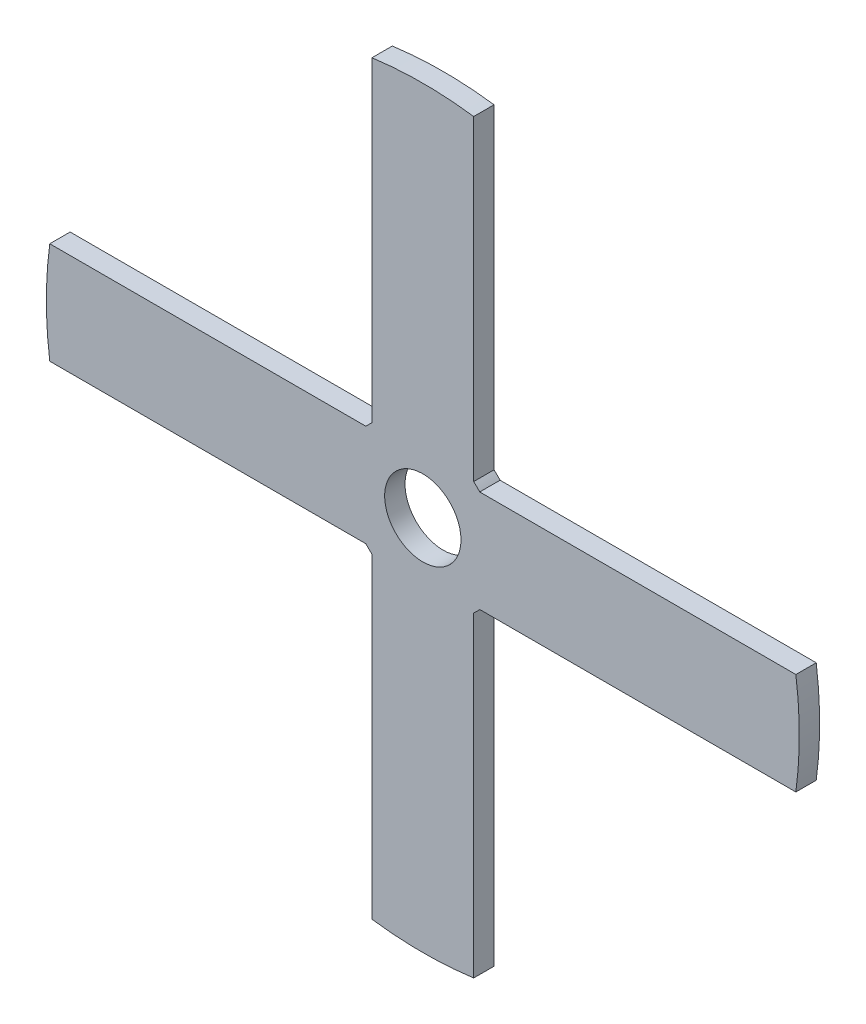
ISO-10303-21;
HEADER;
FILE_DESCRIPTION(('STEP AP214'),'2;1');
FILE_NAME('part.step','',(''),(''),'','','');
FILE_SCHEMA(('AUTOMOTIVE_DESIGN { 1 0 10303 214 1 1 1 1 }'));
ENDSEC;
DATA;
#1=APPLICATION_CONTEXT('core data for automotive mechanical design processes');
#2=APPLICATION_PROTOCOL_DEFINITION('international standard','automotive_design',2000,#1);
#3=PRODUCT_CONTEXT('',#1,'mechanical');
#4=PRODUCT('Part','Part','',(#3));
#5=PRODUCT_RELATED_PRODUCT_CATEGORY('part','',(#4));
#6=PRODUCT_DEFINITION_FORMATION('','',#4);
#7=PRODUCT_DEFINITION_CONTEXT('part definition',#1,'design');
#8=PRODUCT_DEFINITION('design','',#6,#7);
#9=PRODUCT_DEFINITION_SHAPE('','',#8);
#10=(LENGTH_UNIT() NAMED_UNIT(*) SI_UNIT(.MILLI.,.METRE.));
#11=(NAMED_UNIT(*) PLANE_ANGLE_UNIT() SI_UNIT($,.RADIAN.));
#12=(NAMED_UNIT(*) SI_UNIT($,.STERADIAN.) SOLID_ANGLE_UNIT());
#13=UNCERTAINTY_MEASURE_WITH_UNIT(LENGTH_MEASURE(1.E-05),#10,'distance_accuracy_value','');
#14=(GEOMETRIC_REPRESENTATION_CONTEXT(3) GLOBAL_UNCERTAINTY_ASSIGNED_CONTEXT((#13)) GLOBAL_UNIT_ASSIGNED_CONTEXT((#10,
#11,#12)) REPRESENTATION_CONTEXT('',''));
#15=CARTESIAN_POINT('',(0.,0.,0.));
#16=DIRECTION('',(0.,0.,1.));
#17=DIRECTION('',(1.,0.,0.));
#18=AXIS2_PLACEMENT_3D('',#15,#16,#17);
#19=CARTESIAN_POINT('',(0.,0.,8.));
#20=DIRECTION('',(0.,0.,1.));
#21=DIRECTION('',(1.,0.,0.));
#22=AXIS2_PLACEMENT_3D('',#19,#20,#21);
#23=PLANE('',#22);
#24=CARTESIAN_POINT('',(0.,0.,8.));
#25=DIRECTION('',(0.,0.,1.));
#26=DIRECTION('',(1.,0.,0.));
#27=AXIS2_PLACEMENT_3D('',#24,#25,#26);
#28=CIRCLE('',#27,148.);
#29=CARTESIAN_POINT('',(20.,146.642422238587,8.));
#30=VERTEX_POINT('',#29);
#31=CARTESIAN_POINT('',(-20.,146.642422238587,8.));
#32=VERTEX_POINT('',#31);
#33=EDGE_CURVE('E209',#30,#32,#28,.T.);
#34=ORIENTED_EDGE('',*,*,#33,.T.);
#35=DIRECTION('',(0.,-1.,0.));
#36=VECTOR('',#35,1.);
#37=CARTESIAN_POINT('',(-20.,22.3606797749979,8.));
#38=LINE('',#37,#36);
#39=CARTESIAN_POINT('',(-20.,22.3606797749979,8.));
#40=VERTEX_POINT('',#39);
#41=EDGE_CURVE('E117',#32,#40,#38,.T.);
#42=ORIENTED_EDGE('',*,*,#41,.T.);
#43=CARTESIAN_POINT('',(0.,0.,8.));
#44=DIRECTION('',(0.,0.,1.));
#45=DIRECTION('',(1.,0.,0.));
#46=AXIS2_PLACEMENT_3D('',#43,#44,#45);
#47=CIRCLE('',#46,30.);
#48=CARTESIAN_POINT('',(-22.3606797749977,20.0000000000002,8.));
#49=VERTEX_POINT('',#48);
#50=EDGE_CURVE('E248',#40,#49,#47,.T.);
#51=ORIENTED_EDGE('',*,*,#50,.T.);
#52=DIRECTION('',(-1.,0.,0.));
#53=VECTOR('',#52,1.);
#54=CARTESIAN_POINT('',(-22.3606797749977,20.0000000000002,8.));
#55=LINE('',#54,#53);
#56=CARTESIAN_POINT('',(-146.642422238587,20.,8.));
#57=VERTEX_POINT('',#56);
#58=EDGE_CURVE('E267',#49,#57,#55,.T.);
#59=ORIENTED_EDGE('',*,*,#58,.T.);
#60=CARTESIAN_POINT('',(0.,0.,8.));
#61=DIRECTION('',(0.,0.,1.));
#62=DIRECTION('',(1.,0.,0.));
#63=AXIS2_PLACEMENT_3D('',#60,#61,#62);
#64=CIRCLE('',#63,148.);
#65=CARTESIAN_POINT('',(-146.642422238587,-20.,8.));
#66=VERTEX_POINT('',#65);
#67=EDGE_CURVE('E264',#57,#66,#64,.T.);
#68=ORIENTED_EDGE('',*,*,#67,.T.);
#69=DIRECTION('',(1.,0.,0.));
#70=VECTOR('',#69,1.);
#71=CARTESIAN_POINT('',(-22.3606797749981,-19.9999999999998,8.));
#72=LINE('',#71,#70);
#73=CARTESIAN_POINT('',(-22.3606797749981,-19.9999999999998,8.));
#74=VERTEX_POINT('',#73);
#75=EDGE_CURVE('E266',#66,#74,#72,.T.);
#76=ORIENTED_EDGE('',*,*,#75,.T.);
#77=CARTESIAN_POINT('',(0.,0.,8.));
#78=DIRECTION('',(0.,0.,1.));
#79=DIRECTION('',(1.,0.,0.));
#80=AXIS2_PLACEMENT_3D('',#77,#78,#79);
#81=CIRCLE('',#80,30.);
#82=CARTESIAN_POINT('',(-20.0000000000001,-22.3606797749978,8.));
#83=VERTEX_POINT('',#82);
#84=EDGE_CURVE('E269',#74,#83,#81,.T.);
#85=ORIENTED_EDGE('',*,*,#84,.T.);
#86=DIRECTION('',(0.,-1.,0.));
#87=VECTOR('',#86,1.);
#88=CARTESIAN_POINT('',(-20.0000000000001,-22.3606797749978,8.));
#89=LINE('',#88,#87);
#90=CARTESIAN_POINT('',(-20.0000000000001,-146.642422238587,8.));
#91=VERTEX_POINT('',#90);
#92=EDGE_CURVE('E275',#83,#91,#89,.T.);
#93=ORIENTED_EDGE('',*,*,#92,.T.);
#94=CARTESIAN_POINT('',(0.,0.,8.));
#95=DIRECTION('',(0.,0.,1.));
#96=DIRECTION('',(1.,0.,0.));
#97=AXIS2_PLACEMENT_3D('',#94,#95,#96);
#98=CIRCLE('',#97,148.);
#99=CARTESIAN_POINT('',(20.,-146.642422238587,8.));
#100=VERTEX_POINT('',#99);
#101=EDGE_CURVE('E277',#91,#100,#98,.T.);
#102=ORIENTED_EDGE('',*,*,#101,.T.);
#103=DIRECTION('',(0.,1.,0.));
#104=VECTOR('',#103,1.);
#105=CARTESIAN_POINT('',(19.9999999999999,-22.360679774998,8.));
#106=LINE('',#105,#104);
#107=CARTESIAN_POINT('',(19.9999999999998,-22.360679774998,8.));
#108=VERTEX_POINT('',#107);
#109=EDGE_CURVE('E279',#100,#108,#106,.T.);
#110=ORIENTED_EDGE('',*,*,#109,.T.);
#111=CARTESIAN_POINT('',(0.,0.,8.));
#112=DIRECTION('',(0.,0.,1.));
#113=DIRECTION('',(1.,0.,0.));
#114=AXIS2_PLACEMENT_3D('',#111,#112,#113);
#115=CIRCLE('',#114,30.);
#116=CARTESIAN_POINT('',(22.3606797749978,-20.0000000000001,8.));
#117=VERTEX_POINT('',#116);
#118=EDGE_CURVE('E281',#108,#117,#115,.T.);
#119=ORIENTED_EDGE('',*,*,#118,.T.);
#120=DIRECTION('',(1.,0.,0.));
#121=VECTOR('',#120,1.);
#122=CARTESIAN_POINT('',(22.3606797749978,-20.0000000000001,8.));
#123=LINE('',#122,#121);
#124=CARTESIAN_POINT('',(146.642422238587,-20.,8.));
#125=VERTEX_POINT('',#124);
#126=EDGE_CURVE('E283',#117,#125,#123,.T.);
#127=ORIENTED_EDGE('',*,*,#126,.T.);
#128=CARTESIAN_POINT('',(0.,0.,8.));
#129=DIRECTION('',(0.,0.,1.));
#130=DIRECTION('',(1.,0.,0.));
#131=AXIS2_PLACEMENT_3D('',#128,#129,#130);
#132=CIRCLE('',#131,148.);
#133=CARTESIAN_POINT('',(146.642422238587,20.,8.));
#134=VERTEX_POINT('',#133);
#135=EDGE_CURVE('E160',#125,#134,#132,.T.);
#136=ORIENTED_EDGE('',*,*,#135,.T.);
#137=DIRECTION('',(-1.,0.,0.));
#138=VECTOR('',#137,1.);
#139=CARTESIAN_POINT('',(22.360679774998,19.9999999999999,8.));
#140=LINE('',#139,#138);
#141=CARTESIAN_POINT('',(22.360679774998,19.9999999999999,8.));
#142=VERTEX_POINT('',#141);
#143=EDGE_CURVE('E154',#134,#142,#140,.T.);
#144=ORIENTED_EDGE('',*,*,#143,.T.);
#145=CARTESIAN_POINT('',(0.,0.,8.));
#146=DIRECTION('',(0.,0.,1.));
#147=DIRECTION('',(1.,0.,0.));
#148=AXIS2_PLACEMENT_3D('',#145,#146,#147);
#149=CIRCLE('',#148,30.);
#150=CARTESIAN_POINT('',(20.,22.3606797749979,8.));
#151=VERTEX_POINT('',#150);
#152=EDGE_CURVE('E158',#142,#151,#149,.T.);
#153=ORIENTED_EDGE('',*,*,#152,.T.);
#154=DIRECTION('',(0.,1.,0.));
#155=VECTOR('',#154,1.);
#156=CARTESIAN_POINT('',(20.,22.3606797749979,8.));
#157=LINE('',#156,#155);
#158=EDGE_CURVE('E50',#151,#30,#157,.T.);
#159=ORIENTED_EDGE('',*,*,#158,.T.);
#160=EDGE_LOOP('',(#34,#42,#51,#59,#68,#76,#85,#93,#102,#110,#119,#127,#136,#144,#153,#159));
#161=FACE_BOUND('',#160,.T.);
#162=CARTESIAN_POINT('',(0.,0.,8.));
#163=DIRECTION('',(0.,0.,1.));
#164=DIRECTION('',(1.,0.,0.));
#165=AXIS2_PLACEMENT_3D('',#162,#163,#164);
#166=CIRCLE('',#165,15.);
#167=CARTESIAN_POINT('',(15.,0.,8.));
#168=VERTEX_POINT('',#167);
#169=EDGE_CURVE('E182',#168,#168,#166,.T.);
#170=ORIENTED_EDGE('',*,*,#169,.F.);
#171=EDGE_LOOP('',(#170));
#172=FACE_BOUND('',#171,.T.);
#173=ADVANCED_FACE('F33',(#161,#172),#23,.T.);
#174=CARTESIAN_POINT('',(0.,0.,0.));
#175=DIRECTION('',(0.,0.,1.));
#176=DIRECTION('',(1.,0.,0.));
#177=AXIS2_PLACEMENT_3D('',#174,#175,#176);
#178=PLANE('',#177);
#179=CARTESIAN_POINT('',(0.,0.,0.));
#180=DIRECTION('',(0.,0.,1.));
#181=DIRECTION('',(1.,0.,0.));
#182=AXIS2_PLACEMENT_3D('',#179,#180,#181);
#183=CIRCLE('',#182,148.);
#184=CARTESIAN_POINT('',(20.,146.642422238587,0.));
#185=VERTEX_POINT('',#184);
#186=CARTESIAN_POINT('',(-20.,146.642422238587,0.));
#187=VERTEX_POINT('',#186);
#188=EDGE_CURVE('E178',#185,#187,#183,.T.);
#189=ORIENTED_EDGE('',*,*,#188,.F.);
#190=DIRECTION('',(0.,1.,0.));
#191=VECTOR('',#190,1.);
#192=CARTESIAN_POINT('',(20.,22.3606797749979,0.));
#193=LINE('',#192,#191);
#194=CARTESIAN_POINT('',(20.,22.3606797749979,0.));
#195=VERTEX_POINT('',#194);
#196=EDGE_CURVE('E109',#195,#185,#193,.T.);
#197=ORIENTED_EDGE('',*,*,#196,.F.);
#198=CARTESIAN_POINT('',(0.,0.,0.));
#199=DIRECTION('',(0.,0.,1.));
#200=DIRECTION('',(1.,0.,0.));
#201=AXIS2_PLACEMENT_3D('',#198,#199,#200);
#202=CIRCLE('',#201,30.);
#203=CARTESIAN_POINT('',(22.360679774998,19.9999999999999,0.));
#204=VERTEX_POINT('',#203);
#205=EDGE_CURVE('E103',#204,#195,#202,.T.);
#206=ORIENTED_EDGE('',*,*,#205,.F.);
#207=DIRECTION('',(-1.,0.,0.));
#208=VECTOR('',#207,1.);
#209=CARTESIAN_POINT('',(22.360679774998,19.9999999999999,0.));
#210=LINE('',#209,#208);
#211=CARTESIAN_POINT('',(146.642422238587,20.,0.));
#212=VERTEX_POINT('',#211);
#213=EDGE_CURVE('E168',#212,#204,#210,.T.);
#214=ORIENTED_EDGE('',*,*,#213,.F.);
#215=CARTESIAN_POINT('',(0.,0.,0.));
#216=DIRECTION('',(0.,0.,1.));
#217=DIRECTION('',(1.,0.,0.));
#218=AXIS2_PLACEMENT_3D('',#215,#216,#217);
#219=CIRCLE('',#218,148.);
#220=CARTESIAN_POINT('',(146.642422238587,-20.,0.));
#221=VERTEX_POINT('',#220);
#222=EDGE_CURVE('E204',#221,#212,#219,.T.);
#223=ORIENTED_EDGE('',*,*,#222,.F.);
#224=DIRECTION('',(1.,0.,0.));
#225=VECTOR('',#224,1.);
#226=CARTESIAN_POINT('',(22.3606797749978,-20.0000000000001,0.));
#227=LINE('',#226,#225);
#228=CARTESIAN_POINT('',(22.3606797749978,-20.0000000000001,0.));
#229=VERTEX_POINT('',#228);
#230=EDGE_CURVE('E202',#229,#221,#227,.T.);
#231=ORIENTED_EDGE('',*,*,#230,.F.);
#232=CARTESIAN_POINT('',(0.,0.,0.));
#233=DIRECTION('',(0.,0.,1.));
#234=DIRECTION('',(1.,0.,0.));
#235=AXIS2_PLACEMENT_3D('',#232,#233,#234);
#236=CIRCLE('',#235,30.);
#237=CARTESIAN_POINT('',(19.9999999999998,-22.360679774998,0.));
#238=VERTEX_POINT('',#237);
#239=EDGE_CURVE('E200',#238,#229,#236,.T.);
#240=ORIENTED_EDGE('',*,*,#239,.F.);
#241=DIRECTION('',(0.,1.,0.));
#242=VECTOR('',#241,1.);
#243=CARTESIAN_POINT('',(19.9999999999999,-22.360679774998,0.));
#244=LINE('',#243,#242);
#245=CARTESIAN_POINT('',(20.,-146.642422238587,0.));
#246=VERTEX_POINT('',#245);
#247=EDGE_CURVE('E198',#246,#238,#244,.T.);
#248=ORIENTED_EDGE('',*,*,#247,.F.);
#249=CARTESIAN_POINT('',(0.,0.,0.));
#250=DIRECTION('',(0.,0.,1.));
#251=DIRECTION('',(1.,0.,0.));
#252=AXIS2_PLACEMENT_3D('',#249,#250,#251);
#253=CIRCLE('',#252,148.);
#254=CARTESIAN_POINT('',(-20.0000000000001,-146.642422238587,0.));
#255=VERTEX_POINT('',#254);
#256=EDGE_CURVE('E196',#255,#246,#253,.T.);
#257=ORIENTED_EDGE('',*,*,#256,.F.);
#258=DIRECTION('',(0.,-1.,0.));
#259=VECTOR('',#258,1.);
#260=CARTESIAN_POINT('',(-20.0000000000001,-22.3606797749978,0.));
#261=LINE('',#260,#259);
#262=CARTESIAN_POINT('',(-20.0000000000001,-22.3606797749978,0.));
#263=VERTEX_POINT('',#262);
#264=EDGE_CURVE('E194',#263,#255,#261,.T.);
#265=ORIENTED_EDGE('',*,*,#264,.F.);
#266=CARTESIAN_POINT('',(0.,0.,0.));
#267=DIRECTION('',(0.,0.,1.));
#268=DIRECTION('',(1.,0.,0.));
#269=AXIS2_PLACEMENT_3D('',#266,#267,#268);
#270=CIRCLE('',#269,30.);
#271=CARTESIAN_POINT('',(-22.3606797749981,-19.9999999999998,0.));
#272=VERTEX_POINT('',#271);
#273=EDGE_CURVE('E192',#272,#263,#270,.T.);
#274=ORIENTED_EDGE('',*,*,#273,.F.);
#275=DIRECTION('',(1.,0.,0.));
#276=VECTOR('',#275,1.);
#277=CARTESIAN_POINT('',(-22.3606797749981,-19.9999999999998,0.));
#278=LINE('',#277,#276);
#279=CARTESIAN_POINT('',(-146.642422238587,-20.,0.));
#280=VERTEX_POINT('',#279);
#281=EDGE_CURVE('E190',#280,#272,#278,.T.);
#282=ORIENTED_EDGE('',*,*,#281,.F.);
#283=CARTESIAN_POINT('',(0.,0.,0.));
#284=DIRECTION('',(0.,0.,1.));
#285=DIRECTION('',(1.,0.,0.));
#286=AXIS2_PLACEMENT_3D('',#283,#284,#285);
#287=CIRCLE('',#286,148.);
#288=CARTESIAN_POINT('',(-146.642422238587,20.,0.));
#289=VERTEX_POINT('',#288);
#290=EDGE_CURVE('E188',#289,#280,#287,.T.);
#291=ORIENTED_EDGE('',*,*,#290,.F.);
#292=DIRECTION('',(-1.,0.,0.));
#293=VECTOR('',#292,1.);
#294=CARTESIAN_POINT('',(-22.3606797749977,20.0000000000002,0.));
#295=LINE('',#294,#293);
#296=CARTESIAN_POINT('',(-22.3606797749977,20.0000000000002,0.));
#297=VERTEX_POINT('',#296);
#298=EDGE_CURVE('E186',#297,#289,#295,.T.);
#299=ORIENTED_EDGE('',*,*,#298,.F.);
#300=CARTESIAN_POINT('',(0.,0.,0.));
#301=DIRECTION('',(0.,0.,1.));
#302=DIRECTION('',(1.,0.,0.));
#303=AXIS2_PLACEMENT_3D('',#300,#301,#302);
#304=CIRCLE('',#303,30.);
#305=CARTESIAN_POINT('',(-20.,22.3606797749979,0.));
#306=VERTEX_POINT('',#305);
#307=EDGE_CURVE('E184',#306,#297,#304,.T.);
#308=ORIENTED_EDGE('',*,*,#307,.F.);
#309=DIRECTION('',(0.,-1.,0.));
#310=VECTOR('',#309,1.);
#311=CARTESIAN_POINT('',(-20.,22.3606797749979,0.));
#312=LINE('',#311,#310);
#313=EDGE_CURVE('E181',#187,#306,#312,.T.);
#314=ORIENTED_EDGE('',*,*,#313,.F.);
#315=EDGE_LOOP('',(#189,#197,#206,#214,#223,#231,#240,#248,#257,#265,#274,#282,#291,#299,#308,#314));
#316=FACE_BOUND('',#315,.T.);
#317=CARTESIAN_POINT('',(0.,0.,0.));
#318=DIRECTION('',(0.,0.,1.));
#319=DIRECTION('',(1.,0.,0.));
#320=AXIS2_PLACEMENT_3D('',#317,#318,#319);
#321=CIRCLE('',#320,15.);
#322=CARTESIAN_POINT('',(15.,0.,0.));
#323=VERTEX_POINT('',#322);
#324=EDGE_CURVE('E482',#323,#323,#321,.T.);
#325=ORIENTED_EDGE('',*,*,#324,.T.);
#326=EDGE_LOOP('',(#325));
#327=FACE_BOUND('',#326,.T.);
#328=ADVANCED_FACE('F252',(#316,#327),#178,.F.);
#329=CARTESIAN_POINT('',(0.,0.,8.));
#330=DIRECTION('',(0.,0.,-1.));
#331=DIRECTION('',(-1.,0.,0.));
#332=AXIS2_PLACEMENT_3D('',#329,#330,#331);
#333=CYLINDRICAL_SURFACE('',#332,148.);
#334=ORIENTED_EDGE('',*,*,#188,.T.);
#335=DIRECTION('',(0.,0.,-1.));
#336=VECTOR('',#335,1.);
#337=CARTESIAN_POINT('',(-20.,146.642422238587,8.));
#338=LINE('',#337,#336);
#339=EDGE_CURVE('E11',#32,#187,#338,.T.);
#340=ORIENTED_EDGE('',*,*,#339,.F.);
#341=ORIENTED_EDGE('',*,*,#33,.F.);
#342=DIRECTION('',(0.,0.,-1.));
#343=VECTOR('',#342,1.);
#344=CARTESIAN_POINT('',(20.,146.642422238587,8.));
#345=LINE('',#344,#343);
#346=EDGE_CURVE('E174',#30,#185,#345,.T.);
#347=ORIENTED_EDGE('',*,*,#346,.T.);
#348=EDGE_LOOP('',(#334,#340,#341,#347));
#349=FACE_BOUND('',#348,.T.);
#350=ADVANCED_FACE('F35',(#349),#333,.T.);
#351=CARTESIAN_POINT('',(-20.,22.3606797749979,8.));
#352=DIRECTION('',(1.,0.,0.));
#353=DIRECTION('',(0.,0.,-1.));
#354=AXIS2_PLACEMENT_3D('',#351,#352,#353);
#355=PLANE('',#354);
#356=ORIENTED_EDGE('',*,*,#313,.T.);
#357=DIRECTION('',(0.,0.,-1.));
#358=VECTOR('',#357,1.);
#359=CARTESIAN_POINT('',(-20.,22.3606797749979,8.));
#360=LINE('',#359,#358);
#361=EDGE_CURVE('E42',#40,#306,#360,.T.);
#362=ORIENTED_EDGE('',*,*,#361,.F.);
#363=ORIENTED_EDGE('',*,*,#41,.F.);
#364=ORIENTED_EDGE('',*,*,#339,.T.);
#365=EDGE_LOOP('',(#356,#362,#363,#364));
#366=FACE_BOUND('',#365,.T.);
#367=ADVANCED_FACE('F317',(#366),#355,.F.);
#368=CARTESIAN_POINT('',(0.,0.,8.));
#369=DIRECTION('',(0.,0.,-1.));
#370=DIRECTION('',(-1.,0.,0.));
#371=AXIS2_PLACEMENT_3D('',#368,#369,#370);
#372=CYLINDRICAL_SURFACE('',#371,30.);
#373=ORIENTED_EDGE('',*,*,#307,.T.);
#374=DIRECTION('',(0.,0.,-1.));
#375=VECTOR('',#374,1.);
#376=CARTESIAN_POINT('',(-22.3606797749977,20.0000000000002,8.));
#377=LINE('',#376,#375);
#378=EDGE_CURVE('E240',#49,#297,#377,.T.);
#379=ORIENTED_EDGE('',*,*,#378,.F.);
#380=ORIENTED_EDGE('',*,*,#50,.F.);
#381=ORIENTED_EDGE('',*,*,#361,.T.);
#382=EDGE_LOOP('',(#373,#379,#380,#381));
#383=FACE_BOUND('',#382,.T.);
#384=ADVANCED_FACE('F246',(#383),#372,.T.);
#385=CARTESIAN_POINT('',(-22.3606797749977,20.0000000000002,8.));
#386=DIRECTION('',(0.,-1.,0.));
#387=DIRECTION('',(1.,0.,0.));
#388=AXIS2_PLACEMENT_3D('',#385,#386,#387);
#389=PLANE('',#388);
#390=ORIENTED_EDGE('',*,*,#298,.T.);
#391=DIRECTION('',(0.,0.,-1.));
#392=VECTOR('',#391,1.);
#393=CARTESIAN_POINT('',(-146.642422238587,20.,8.));
#394=LINE('',#393,#392);
#395=EDGE_CURVE('E237',#57,#289,#394,.T.);
#396=ORIENTED_EDGE('',*,*,#395,.F.);
#397=ORIENTED_EDGE('',*,*,#58,.F.);
#398=ORIENTED_EDGE('',*,*,#378,.T.);
#399=EDGE_LOOP('',(#390,#396,#397,#398));
#400=FACE_BOUND('',#399,.T.);
#401=ADVANCED_FACE('F258',(#400),#389,.F.);
#402=CARTESIAN_POINT('',(0.,0.,8.));
#403=DIRECTION('',(0.,0.,-1.));
#404=DIRECTION('',(-1.,0.,0.));
#405=AXIS2_PLACEMENT_3D('',#402,#403,#404);
#406=CYLINDRICAL_SURFACE('',#405,148.);
#407=ORIENTED_EDGE('',*,*,#290,.T.);
#408=DIRECTION('',(0.,0.,-1.));
#409=VECTOR('',#408,1.);
#410=CARTESIAN_POINT('',(-146.642422238587,-20.,8.));
#411=LINE('',#410,#409);
#412=EDGE_CURVE('E234',#66,#280,#411,.T.);
#413=ORIENTED_EDGE('',*,*,#412,.F.);
#414=ORIENTED_EDGE('',*,*,#67,.F.);
#415=ORIENTED_EDGE('',*,*,#395,.T.);
#416=EDGE_LOOP('',(#407,#413,#414,#415));
#417=FACE_BOUND('',#416,.T.);
#418=ADVANCED_FACE('F262',(#417),#406,.T.);
#419=CARTESIAN_POINT('',(-22.3606797749981,-19.9999999999998,8.));
#420=DIRECTION('',(0.,1.,0.));
#421=DIRECTION('',(-1.,0.,0.));
#422=AXIS2_PLACEMENT_3D('',#419,#420,#421);
#423=PLANE('',#422);
#424=ORIENTED_EDGE('',*,*,#281,.T.);
#425=DIRECTION('',(0.,0.,-1.));
#426=VECTOR('',#425,1.);
#427=CARTESIAN_POINT('',(-22.3606797749981,-19.9999999999998,8.));
#428=LINE('',#427,#426);
#429=EDGE_CURVE('E231',#74,#272,#428,.T.);
#430=ORIENTED_EDGE('',*,*,#429,.F.);
#431=ORIENTED_EDGE('',*,*,#75,.F.);
#432=ORIENTED_EDGE('',*,*,#412,.T.);
#433=EDGE_LOOP('',(#424,#430,#431,#432));
#434=FACE_BOUND('',#433,.T.);
#435=ADVANCED_FACE('F330',(#434),#423,.F.);
#436=CARTESIAN_POINT('',(0.,0.,8.));
#437=DIRECTION('',(0.,0.,-1.));
#438=DIRECTION('',(-1.,0.,0.));
#439=AXIS2_PLACEMENT_3D('',#436,#437,#438);
#440=CYLINDRICAL_SURFACE('',#439,30.);
#441=ORIENTED_EDGE('',*,*,#273,.T.);
#442=DIRECTION('',(0.,0.,-1.));
#443=VECTOR('',#442,1.);
#444=CARTESIAN_POINT('',(-20.0000000000001,-22.3606797749978,8.));
#445=LINE('',#444,#443);
#446=EDGE_CURVE('E228',#83,#263,#445,.T.);
#447=ORIENTED_EDGE('',*,*,#446,.F.);
#448=ORIENTED_EDGE('',*,*,#84,.F.);
#449=ORIENTED_EDGE('',*,*,#429,.T.);
#450=EDGE_LOOP('',(#441,#447,#448,#449));
#451=FACE_BOUND('',#450,.T.);
#452=ADVANCED_FACE('F333',(#451),#440,.T.);
#453=CARTESIAN_POINT('',(-20.0000000000001,-22.3606797749978,8.));
#454=DIRECTION('',(1.,0.,0.));
#455=DIRECTION('',(0.,1.,0.));
#456=AXIS2_PLACEMENT_3D('',#453,#454,#455);
#457=PLANE('',#456);
#458=ORIENTED_EDGE('',*,*,#264,.T.);
#459=DIRECTION('',(0.,0.,-1.));
#460=VECTOR('',#459,1.);
#461=CARTESIAN_POINT('',(-20.0000000000001,-146.642422238587,8.));
#462=LINE('',#461,#460);
#463=EDGE_CURVE('E225',#91,#255,#462,.T.);
#464=ORIENTED_EDGE('',*,*,#463,.F.);
#465=ORIENTED_EDGE('',*,*,#92,.F.);
#466=ORIENTED_EDGE('',*,*,#446,.T.);
#467=EDGE_LOOP('',(#458,#464,#465,#466));
#468=FACE_BOUND('',#467,.T.);
#469=ADVANCED_FACE('F337',(#468),#457,.F.);
#470=CARTESIAN_POINT('',(0.,0.,8.));
#471=DIRECTION('',(0.,0.,-1.));
#472=DIRECTION('',(-1.,0.,0.));
#473=AXIS2_PLACEMENT_3D('',#470,#471,#472);
#474=CYLINDRICAL_SURFACE('',#473,148.);
#475=ORIENTED_EDGE('',*,*,#256,.T.);
#476=DIRECTION('',(0.,0.,-1.));
#477=VECTOR('',#476,1.);
#478=CARTESIAN_POINT('',(20.,-146.642422238587,8.));
#479=LINE('',#478,#477);
#480=EDGE_CURVE('E222',#100,#246,#479,.T.);
#481=ORIENTED_EDGE('',*,*,#480,.F.);
#482=ORIENTED_EDGE('',*,*,#101,.F.);
#483=ORIENTED_EDGE('',*,*,#463,.T.);
#484=EDGE_LOOP('',(#475,#481,#482,#483));
#485=FACE_BOUND('',#484,.T.);
#486=ADVANCED_FACE('F341',(#485),#474,.T.);
#487=CARTESIAN_POINT('',(19.9999999999999,-22.360679774998,8.));
#488=DIRECTION('',(-1.,0.,0.));
#489=DIRECTION('',(0.,-1.,0.));
#490=AXIS2_PLACEMENT_3D('',#487,#488,#489);
#491=PLANE('',#490);
#492=ORIENTED_EDGE('',*,*,#247,.T.);
#493=DIRECTION('',(0.,0.,-1.));
#494=VECTOR('',#493,1.);
#495=CARTESIAN_POINT('',(19.9999999999998,-22.360679774998,8.));
#496=LINE('',#495,#494);
#497=EDGE_CURVE('E219',#108,#238,#496,.T.);
#498=ORIENTED_EDGE('',*,*,#497,.F.);
#499=ORIENTED_EDGE('',*,*,#109,.F.);
#500=ORIENTED_EDGE('',*,*,#480,.T.);
#501=EDGE_LOOP('',(#492,#498,#499,#500));
#502=FACE_BOUND('',#501,.T.);
#503=ADVANCED_FACE('F345',(#502),#491,.F.);
#504=CARTESIAN_POINT('',(0.,0.,8.));
#505=DIRECTION('',(0.,0.,-1.));
#506=DIRECTION('',(-1.,0.,0.));
#507=AXIS2_PLACEMENT_3D('',#504,#505,#506);
#508=CYLINDRICAL_SURFACE('',#507,30.);
#509=ORIENTED_EDGE('',*,*,#239,.T.);
#510=DIRECTION('',(0.,0.,-1.));
#511=VECTOR('',#510,1.);
#512=CARTESIAN_POINT('',(22.3606797749978,-20.0000000000001,8.));
#513=LINE('',#512,#511);
#514=EDGE_CURVE('E216',#117,#229,#513,.T.);
#515=ORIENTED_EDGE('',*,*,#514,.F.);
#516=ORIENTED_EDGE('',*,*,#118,.F.);
#517=ORIENTED_EDGE('',*,*,#497,.T.);
#518=EDGE_LOOP('',(#509,#515,#516,#517));
#519=FACE_BOUND('',#518,.T.);
#520=ADVANCED_FACE('F349',(#519),#508,.T.);
#521=CARTESIAN_POINT('',(22.3606797749978,-20.0000000000001,8.));
#522=DIRECTION('',(0.,1.,0.));
#523=DIRECTION('',(-1.,0.,0.));
#524=AXIS2_PLACEMENT_3D('',#521,#522,#523);
#525=PLANE('',#524);
#526=ORIENTED_EDGE('',*,*,#230,.T.);
#527=DIRECTION('',(0.,0.,-1.));
#528=VECTOR('',#527,1.);
#529=CARTESIAN_POINT('',(146.642422238587,-20.,8.));
#530=LINE('',#529,#528);
#531=EDGE_CURVE('E213',#125,#221,#530,.T.);
#532=ORIENTED_EDGE('',*,*,#531,.F.);
#533=ORIENTED_EDGE('',*,*,#126,.F.);
#534=ORIENTED_EDGE('',*,*,#514,.T.);
#535=EDGE_LOOP('',(#526,#532,#533,#534));
#536=FACE_BOUND('',#535,.T.);
#537=ADVANCED_FACE('F289',(#536),#525,.F.);
#538=CARTESIAN_POINT('',(0.,0.,8.));
#539=DIRECTION('',(0.,0.,-1.));
#540=DIRECTION('',(-1.,0.,0.));
#541=AXIS2_PLACEMENT_3D('',#538,#539,#540);
#542=CYLINDRICAL_SURFACE('',#541,148.);
#543=ORIENTED_EDGE('',*,*,#222,.T.);
#544=DIRECTION('',(0.,0.,-1.));
#545=VECTOR('',#544,1.);
#546=CARTESIAN_POINT('',(146.642422238587,20.,8.));
#547=LINE('',#546,#545);
#548=EDGE_CURVE('E169',#134,#212,#547,.T.);
#549=ORIENTED_EDGE('',*,*,#548,.F.);
#550=ORIENTED_EDGE('',*,*,#135,.F.);
#551=ORIENTED_EDGE('',*,*,#531,.T.);
#552=EDGE_LOOP('',(#543,#549,#550,#551));
#553=FACE_BOUND('',#552,.T.);
#554=ADVANCED_FACE('F293',(#553),#542,.T.);
#555=CARTESIAN_POINT('',(22.360679774998,19.9999999999999,8.));
#556=DIRECTION('',(0.,-1.,0.));
#557=DIRECTION('',(1.,0.,0.));
#558=AXIS2_PLACEMENT_3D('',#555,#556,#557);
#559=PLANE('',#558);
#560=ORIENTED_EDGE('',*,*,#213,.T.);
#561=DIRECTION('',(0.,0.,-1.));
#562=VECTOR('',#561,1.);
#563=CARTESIAN_POINT('',(22.360679774998,19.9999999999999,8.));
#564=LINE('',#563,#562);
#565=EDGE_CURVE('E165',#142,#204,#564,.T.);
#566=ORIENTED_EDGE('',*,*,#565,.F.);
#567=ORIENTED_EDGE('',*,*,#143,.F.);
#568=ORIENTED_EDGE('',*,*,#548,.T.);
#569=EDGE_LOOP('',(#560,#566,#567,#568));
#570=FACE_BOUND('',#569,.T.);
#571=ADVANCED_FACE('F166',(#570),#559,.F.);
#572=CARTESIAN_POINT('',(0.,0.,8.));
#573=DIRECTION('',(0.,0.,-1.));
#574=DIRECTION('',(-1.,0.,0.));
#575=AXIS2_PLACEMENT_3D('',#572,#573,#574);
#576=CYLINDRICAL_SURFACE('',#575,30.);
#577=ORIENTED_EDGE('',*,*,#205,.T.);
#578=DIRECTION('',(0.,0.,-1.));
#579=VECTOR('',#578,1.);
#580=CARTESIAN_POINT('',(20.,22.3606797749979,8.));
#581=LINE('',#580,#579);
#582=EDGE_CURVE('E170',#151,#195,#581,.T.);
#583=ORIENTED_EDGE('',*,*,#582,.F.);
#584=ORIENTED_EDGE('',*,*,#152,.F.);
#585=ORIENTED_EDGE('',*,*,#565,.T.);
#586=EDGE_LOOP('',(#577,#583,#584,#585));
#587=FACE_BOUND('',#586,.T.);
#588=ADVANCED_FACE('F172',(#587),#576,.T.);
#589=CARTESIAN_POINT('',(20.,22.3606797749979,8.));
#590=DIRECTION('',(-1.,0.,0.));
#591=DIRECTION('',(0.,0.,1.));
#592=AXIS2_PLACEMENT_3D('',#589,#590,#591);
#593=PLANE('',#592);
#594=ORIENTED_EDGE('',*,*,#196,.T.);
#595=ORIENTED_EDGE('',*,*,#346,.F.);
#596=ORIENTED_EDGE('',*,*,#158,.F.);
#597=ORIENTED_EDGE('',*,*,#582,.T.);
#598=EDGE_LOOP('',(#594,#595,#596,#597));
#599=FACE_BOUND('',#598,.T.);
#600=ADVANCED_FACE('F297',(#599),#593,.F.);
#601=CARTESIAN_POINT('',(0.,0.,8.));
#602=DIRECTION('',(0.,0.,-1.));
#603=DIRECTION('',(-1.,0.,0.));
#604=AXIS2_PLACEMENT_3D('',#601,#602,#603);
#605=CYLINDRICAL_SURFACE('',#604,15.);
#606=ORIENTED_EDGE('',*,*,#169,.T.);
#607=EDGE_LOOP('',(#606));
#608=FACE_BOUND('',#607,.T.);
#609=ORIENTED_EDGE('',*,*,#324,.F.);
#610=EDGE_LOOP('',(#609));
#611=FACE_BOUND('',#610,.T.);
#612=ADVANCED_FACE('F299',(#608,#611),#605,.F.);
#613=CLOSED_SHELL('',(#173,#328,#350,#367,#384,#401,#418,#435,#452,#469,#486,#503,#520,#537,
#554,#571,#588,#600,#612));
#614=MANIFOLD_SOLID_BREP('B2',#613);
#615=ADVANCED_BREP_SHAPE_REPRESENTATION('',(#18,#614),#14);
#616=SHAPE_DEFINITION_REPRESENTATION(#9,#615);
ENDSEC;
END-ISO-10303-21;
